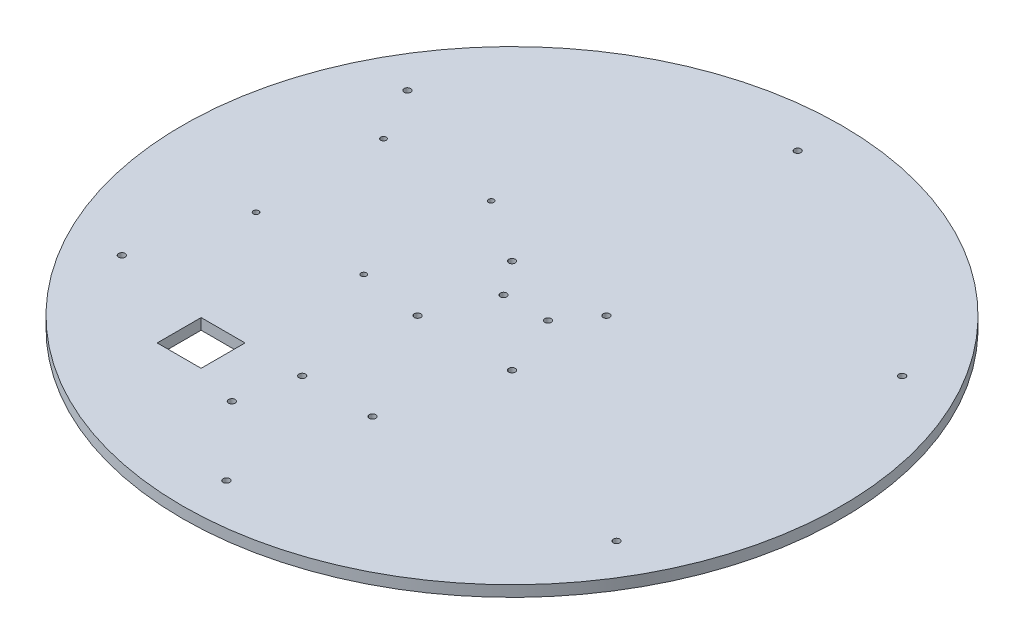
ISO-10303-21;
HEADER;
FILE_DESCRIPTION(('STEP AP214'),'2;1');
FILE_NAME('part.step','',(''),(''),'','','');
FILE_SCHEMA(('AUTOMOTIVE_DESIGN { 1 0 10303 214 1 1 1 1 }'));
ENDSEC;
DATA;
#1=APPLICATION_CONTEXT('core data for automotive mechanical design processes');
#2=APPLICATION_PROTOCOL_DEFINITION('international standard','automotive_design',2000,#1);
#3=PRODUCT_CONTEXT('',#1,'mechanical');
#4=PRODUCT('Part','Part','',(#3));
#5=PRODUCT_RELATED_PRODUCT_CATEGORY('part','',(#4));
#6=PRODUCT_DEFINITION_FORMATION('','',#4);
#7=PRODUCT_DEFINITION_CONTEXT('part definition',#1,'design');
#8=PRODUCT_DEFINITION('design','',#6,#7);
#9=PRODUCT_DEFINITION_SHAPE('','',#8);
#10=(LENGTH_UNIT() NAMED_UNIT(*) SI_UNIT(.MILLI.,.METRE.));
#11=(NAMED_UNIT(*) PLANE_ANGLE_UNIT() SI_UNIT($,.RADIAN.));
#12=(NAMED_UNIT(*) SI_UNIT($,.STERADIAN.) SOLID_ANGLE_UNIT());
#13=UNCERTAINTY_MEASURE_WITH_UNIT(LENGTH_MEASURE(1.E-05),#10,'distance_accuracy_value','');
#14=(GEOMETRIC_REPRESENTATION_CONTEXT(3) GLOBAL_UNCERTAINTY_ASSIGNED_CONTEXT((#13)) GLOBAL_UNIT_ASSIGNED_CONTEXT((#10,
#11,#12)) REPRESENTATION_CONTEXT('',''));
#15=CARTESIAN_POINT('',(0.,0.,0.));
#16=DIRECTION('',(0.,0.,1.));
#17=DIRECTION('',(1.,0.,0.));
#18=AXIS2_PLACEMENT_3D('',#15,#16,#17);
#19=CARTESIAN_POINT('',(0.,5.,0.));
#20=DIRECTION('',(0.,-1.,0.));
#21=DIRECTION('',(0.,0.,-1.));
#22=AXIS2_PLACEMENT_3D('',#19,#20,#21);
#23=CYLINDRICAL_SURFACE('',#22,150.);
#24=CARTESIAN_POINT('',(0.,5.,0.));
#25=DIRECTION('',(0.,1.,0.));
#26=DIRECTION('',(0.,0.,1.));
#27=AXIS2_PLACEMENT_3D('',#24,#25,#26);
#28=CIRCLE('',#27,150.);
#29=CARTESIAN_POINT('',(0.,5.,150.));
#30=VERTEX_POINT('',#29);
#31=EDGE_CURVE('E11',#30,#30,#28,.T.);
#32=ORIENTED_EDGE('',*,*,#31,.F.);
#33=EDGE_LOOP('',(#32));
#34=FACE_BOUND('',#33,.T.);
#35=CARTESIAN_POINT('',(0.,0.,0.));
#36=DIRECTION('',(0.,1.,0.));
#37=DIRECTION('',(0.,0.,1.));
#38=AXIS2_PLACEMENT_3D('',#35,#36,#37);
#39=CIRCLE('',#38,150.);
#40=CARTESIAN_POINT('',(0.,0.,150.));
#41=VERTEX_POINT('',#40);
#42=EDGE_CURVE('E42',#41,#41,#39,.T.);
#43=ORIENTED_EDGE('',*,*,#42,.T.);
#44=EDGE_LOOP('',(#43));
#45=FACE_BOUND('',#44,.T.);
#46=ADVANCED_FACE('F39',(#34,#45),#23,.T.);
#47=CARTESIAN_POINT('',(0.,5.,0.));
#48=DIRECTION('',(0.,1.,0.));
#49=DIRECTION('',(0.,0.,1.));
#50=AXIS2_PLACEMENT_3D('',#47,#48,#49);
#51=PLANE('',#50);
#52=CARTESIAN_POINT('',(-50.,5.,17.5));
#53=DIRECTION('',(0.,1.,0.));
#54=DIRECTION('',(0.,0.,1.));
#55=AXIS2_PLACEMENT_3D('',#52,#53,#54);
#56=CIRCLE('',#55,1.25);
#57=CARTESIAN_POINT('',(-50.,5.,18.75));
#58=VERTEX_POINT('',#57);
#59=EDGE_CURVE('E334',#58,#58,#56,.T.);
#60=ORIENTED_EDGE('',*,*,#59,.F.);
#61=EDGE_LOOP('',(#60));
#62=FACE_BOUND('',#61,.T.);
#63=CARTESIAN_POINT('',(-99.,5.,17.5));
#64=DIRECTION('',(0.,1.,0.));
#65=DIRECTION('',(0.,0.,1.));
#66=AXIS2_PLACEMENT_3D('',#63,#64,#65);
#67=CIRCLE('',#66,1.25);
#68=CARTESIAN_POINT('',(-99.,5.,18.75));
#69=VERTEX_POINT('',#68);
#70=EDGE_CURVE('E326',#69,#69,#67,.T.);
#71=ORIENTED_EDGE('',*,*,#70,.F.);
#72=EDGE_LOOP('',(#71));
#73=FACE_BOUND('',#72,.T.);
#74=CARTESIAN_POINT('',(-99.,5.,-40.5));
#75=DIRECTION('',(0.,1.,0.));
#76=DIRECTION('',(0.,0.,1.));
#77=AXIS2_PLACEMENT_3D('',#74,#75,#76);
#78=CIRCLE('',#77,1.25);
#79=CARTESIAN_POINT('',(-99.,5.,-39.25));
#80=VERTEX_POINT('',#79);
#81=EDGE_CURVE('E320',#80,#80,#78,.T.);
#82=ORIENTED_EDGE('',*,*,#81,.F.);
#83=EDGE_LOOP('',(#82));
#84=FACE_BOUND('',#83,.T.);
#85=CARTESIAN_POINT('',(-50.,5.,-40.5));
#86=DIRECTION('',(0.,1.,0.));
#87=DIRECTION('',(0.,0.,1.));
#88=AXIS2_PLACEMENT_3D('',#85,#86,#87);
#89=CIRCLE('',#88,1.25);
#90=CARTESIAN_POINT('',(-50.,5.,-39.25));
#91=VERTEX_POINT('',#90);
#92=EDGE_CURVE('E322',#91,#91,#89,.T.);
#93=ORIENTED_EDGE('',*,*,#92,.F.);
#94=EDGE_LOOP('',(#93));
#95=FACE_BOUND('',#94,.T.);
#96=DIRECTION('',(0.,0.,-1.));
#97=VECTOR('',#96,1.);
#98=CARTESIAN_POINT('',(-50.,5.,71.5));
#99=LINE('',#98,#97);
#100=CARTESIAN_POINT('',(-50.,5.,91.5));
#101=VERTEX_POINT('',#100);
#102=CARTESIAN_POINT('',(-50.,5.,71.5));
#103=VERTEX_POINT('',#102);
#104=EDGE_CURVE('E53',#101,#103,#99,.T.);
#105=ORIENTED_EDGE('',*,*,#104,.F.);
#106=DIRECTION('',(1.,0.,0.));
#107=VECTOR('',#106,1.);
#108=CARTESIAN_POINT('',(-70.,5.,91.5));
#109=LINE('',#108,#107);
#110=CARTESIAN_POINT('',(-70.,5.,91.5));
#111=VERTEX_POINT('',#110);
#112=EDGE_CURVE('E89',#111,#101,#109,.T.);
#113=ORIENTED_EDGE('',*,*,#112,.F.);
#114=DIRECTION('',(0.,0.,1.));
#115=VECTOR('',#114,1.);
#116=CARTESIAN_POINT('',(-70.,5.,71.5));
#117=LINE('',#116,#115);
#118=CARTESIAN_POINT('',(-70.,5.,71.5));
#119=VERTEX_POINT('',#118);
#120=EDGE_CURVE('E94',#119,#111,#117,.T.);
#121=ORIENTED_EDGE('',*,*,#120,.F.);
#122=DIRECTION('',(-1.,0.,0.));
#123=VECTOR('',#122,1.);
#124=CARTESIAN_POINT('',(-70.,5.,71.5));
#125=LINE('',#124,#123);
#126=EDGE_CURVE('E100',#103,#119,#125,.T.);
#127=ORIENTED_EDGE('',*,*,#126,.F.);
#128=EDGE_LOOP('',(#105,#113,#121,#127));
#129=FACE_BOUND('',#128,.T.);
#130=CARTESIAN_POINT('',(7.99999999999999,5.,71.5));
#131=DIRECTION('',(0.,1.,0.));
#132=DIRECTION('',(0.,0.,1.));
#133=AXIS2_PLACEMENT_3D('',#130,#131,#132);
#134=CIRCLE('',#133,1.5);
#135=CARTESIAN_POINT('',(7.99999999999999,5.,73.));
#136=VERTEX_POINT('',#135);
#137=EDGE_CURVE('E104',#136,#136,#134,.T.);
#138=ORIENTED_EDGE('',*,*,#137,.F.);
#139=EDGE_LOOP('',(#138));
#140=FACE_BOUND('',#139,.T.);
#141=CARTESIAN_POINT('',(-30.,5.,97.5));
#142=DIRECTION('',(0.,1.,0.));
#143=DIRECTION('',(0.,0.,1.));
#144=AXIS2_PLACEMENT_3D('',#141,#142,#143);
#145=CIRCLE('',#144,1.5);
#146=CARTESIAN_POINT('',(-30.,5.,99.));
#147=VERTEX_POINT('',#146);
#148=EDGE_CURVE('E124',#147,#147,#145,.T.);
#149=ORIENTED_EDGE('',*,*,#148,.F.);
#150=EDGE_LOOP('',(#149));
#151=FACE_BOUND('',#150,.T.);
#152=CARTESIAN_POINT('',(-24.,5.,71.5));
#153=DIRECTION('',(0.,1.,0.));
#154=DIRECTION('',(0.,0.,1.));
#155=AXIS2_PLACEMENT_3D('',#152,#153,#154);
#156=CIRCLE('',#155,1.5);
#157=CARTESIAN_POINT('',(-24.,5.,73.));
#158=VERTEX_POINT('',#157);
#159=EDGE_CURVE('E121',#158,#158,#156,.T.);
#160=ORIENTED_EDGE('',*,*,#159,.F.);
#161=EDGE_LOOP('',(#160));
#162=FACE_BOUND('',#161,.T.);
#163=CARTESIAN_POINT('',(21.5,5.,-21.5));
#164=DIRECTION('',(0.,1.,0.));
#165=DIRECTION('',(0.,0.,1.));
#166=AXIS2_PLACEMENT_3D('',#163,#164,#165);
#167=CIRCLE('',#166,1.5);
#168=CARTESIAN_POINT('',(21.5,5.,-20.));
#169=VERTEX_POINT('',#168);
#170=EDGE_CURVE('E131',#169,#169,#167,.T.);
#171=ORIENTED_EDGE('',*,*,#170,.F.);
#172=EDGE_LOOP('',(#171));
#173=FACE_BOUND('',#172,.T.);
#174=CARTESIAN_POINT('',(-21.5,5.,21.5));
#175=DIRECTION('',(0.,1.,0.));
#176=DIRECTION('',(0.,0.,1.));
#177=AXIS2_PLACEMENT_3D('',#174,#175,#176);
#178=CIRCLE('',#177,1.5);
#179=CARTESIAN_POINT('',(-21.5,5.,23.));
#180=VERTEX_POINT('',#179);
#181=EDGE_CURVE('E138',#180,#180,#178,.T.);
#182=ORIENTED_EDGE('',*,*,#181,.F.);
#183=EDGE_LOOP('',(#182));
#184=FACE_BOUND('',#183,.T.);
#185=CARTESIAN_POINT('',(21.5,5.,21.5));
#186=DIRECTION('',(0.,1.,0.));
#187=DIRECTION('',(0.,0.,1.));
#188=AXIS2_PLACEMENT_3D('',#185,#186,#187);
#189=CIRCLE('',#188,1.5);
#190=CARTESIAN_POINT('',(21.5,5.,23.));
#191=VERTEX_POINT('',#190);
#192=EDGE_CURVE('E125',#191,#191,#189,.T.);
#193=ORIENTED_EDGE('',*,*,#192,.F.);
#194=EDGE_LOOP('',(#193));
#195=FACE_BOUND('',#194,.T.);
#196=CARTESIAN_POINT('',(-21.5,5.,-21.5));
#197=DIRECTION('',(0.,1.,0.));
#198=DIRECTION('',(0.,0.,1.));
#199=AXIS2_PLACEMENT_3D('',#196,#197,#198);
#200=CIRCLE('',#199,1.5);
#201=CARTESIAN_POINT('',(-21.5,5.,-20.));
#202=VERTEX_POINT('',#201);
#203=EDGE_CURVE('E134',#202,#202,#200,.T.);
#204=ORIENTED_EDGE('',*,*,#203,.F.);
#205=EDGE_LOOP('',(#204));
#206=FACE_BOUND('',#205,.T.);
#207=CARTESIAN_POINT('',(-10.1,5.,-6.25));
#208=DIRECTION('',(0.,1.,0.));
#209=DIRECTION('',(0.,0.,1.));
#210=AXIS2_PLACEMENT_3D('',#207,#208,#209);
#211=CIRCLE('',#210,1.5);
#212=CARTESIAN_POINT('',(-10.1,5.,-4.75));
#213=VERTEX_POINT('',#212);
#214=EDGE_CURVE('E153',#213,#213,#211,.T.);
#215=ORIENTED_EDGE('',*,*,#214,.F.);
#216=EDGE_LOOP('',(#215));
#217=FACE_BOUND('',#216,.T.);
#218=CARTESIAN_POINT('',(10.1,5.,-6.25));
#219=DIRECTION('',(0.,1.,0.));
#220=DIRECTION('',(0.,0.,1.));
#221=AXIS2_PLACEMENT_3D('',#218,#219,#220);
#222=CIRCLE('',#221,1.5);
#223=CARTESIAN_POINT('',(10.1,5.,-4.75));
#224=VERTEX_POINT('',#223);
#225=EDGE_CURVE('E156',#224,#224,#222,.T.);
#226=ORIENTED_EDGE('',*,*,#225,.F.);
#227=EDGE_LOOP('',(#226));
#228=FACE_BOUND('',#227,.T.);
#229=CARTESIAN_POINT('',(0.,5.,-130.));
#230=DIRECTION('',(0.,1.,0.));
#231=DIRECTION('',(0.,0.,1.));
#232=AXIS2_PLACEMENT_3D('',#229,#230,#231);
#233=CIRCLE('',#232,1.5);
#234=CARTESIAN_POINT('',(0.,5.,-128.5));
#235=VERTEX_POINT('',#234);
#236=EDGE_CURVE('E164',#235,#235,#233,.T.);
#237=ORIENTED_EDGE('',*,*,#236,.F.);
#238=EDGE_LOOP('',(#237));
#239=FACE_BOUND('',#238,.T.);
#240=CARTESIAN_POINT('',(-112.583302491976,5.,-65.0000000000013));
#241=DIRECTION('',(0.,1.,0.));
#242=DIRECTION('',(0.,0.,1.));
#243=AXIS2_PLACEMENT_3D('',#240,#241,#242);
#244=CIRCLE('',#243,1.5);
#245=CARTESIAN_POINT('',(-112.583302491976,5.,-63.5000000000013));
#246=VERTEX_POINT('',#245);
#247=EDGE_CURVE('E168',#246,#246,#244,.T.);
#248=ORIENTED_EDGE('',*,*,#247,.F.);
#249=EDGE_LOOP('',(#248));
#250=FACE_BOUND('',#249,.T.);
#251=CARTESIAN_POINT('',(-112.583302491978,5.,64.999999999999));
#252=DIRECTION('',(0.,1.,0.));
#253=DIRECTION('',(0.,0.,1.));
#254=AXIS2_PLACEMENT_3D('',#251,#252,#253);
#255=CIRCLE('',#254,1.50000000000002);
#256=CARTESIAN_POINT('',(-112.583302491978,5.,66.499999999999));
#257=VERTEX_POINT('',#256);
#258=EDGE_CURVE('E191',#257,#257,#255,.T.);
#259=ORIENTED_EDGE('',*,*,#258,.F.);
#260=EDGE_LOOP('',(#259));
#261=FACE_BOUND('',#260,.T.);
#262=CARTESIAN_POINT('',(-8.94839757847876E-13,5.,130.));
#263=DIRECTION('',(0.,1.,0.));
#264=DIRECTION('',(0.,0.,1.));
#265=AXIS2_PLACEMENT_3D('',#262,#263,#264);
#266=CIRCLE('',#265,1.5);
#267=CARTESIAN_POINT('',(-8.94839757847876E-13,5.,131.5));
#268=VERTEX_POINT('',#267);
#269=EDGE_CURVE('E185',#268,#268,#266,.T.);
#270=ORIENTED_EDGE('',*,*,#269,.F.);
#271=EDGE_LOOP('',(#270));
#272=FACE_BOUND('',#271,.T.);
#273=CARTESIAN_POINT('',(112.583302491977,5.,65.0000000000005));
#274=DIRECTION('',(0.,1.,0.));
#275=DIRECTION('',(0.,0.,1.));
#276=AXIS2_PLACEMENT_3D('',#273,#274,#275);
#277=CIRCLE('',#276,1.50000000000651);
#278=CARTESIAN_POINT('',(112.583302491977,5.,66.500000000007));
#279=VERTEX_POINT('',#278);
#280=EDGE_CURVE('E179',#279,#279,#277,.T.);
#281=ORIENTED_EDGE('',*,*,#280,.F.);
#282=EDGE_LOOP('',(#281));
#283=FACE_BOUND('',#282,.T.);
#284=CARTESIAN_POINT('',(112.583302491978,5.,-64.9999999999981));
#285=DIRECTION('',(0.,1.,0.));
#286=DIRECTION('',(0.,0.,1.));
#287=AXIS2_PLACEMENT_3D('',#284,#285,#286);
#288=CIRCLE('',#287,1.50000000000931);
#289=CARTESIAN_POINT('',(112.583302491978,5.,-63.4999999999888));
#290=VERTEX_POINT('',#289);
#291=EDGE_CURVE('E167',#290,#290,#288,.T.);
#292=ORIENTED_EDGE('',*,*,#291,.F.);
#293=EDGE_LOOP('',(#292));
#294=FACE_BOUND('',#293,.T.);
#295=ORIENTED_EDGE('',*,*,#31,.T.);
#296=EDGE_LOOP('',(#295));
#297=FACE_BOUND('',#296,.T.);
#298=ADVANCED_FACE('F97',(#62,#73,#84,#95,#129,#140,#151,#162,#173,#184,#195,#206,#217,#228,
#239,#250,#261,#272,#283,#294,#297),#51,.T.);
#299=CARTESIAN_POINT('',(0.,0.,0.));
#300=DIRECTION('',(0.,1.,0.));
#301=DIRECTION('',(0.,0.,1.));
#302=AXIS2_PLACEMENT_3D('',#299,#300,#301);
#303=PLANE('',#302);
#304=CARTESIAN_POINT('',(-50.,0.,17.5));
#305=DIRECTION('',(0.,1.,0.));
#306=DIRECTION('',(0.,0.,1.));
#307=AXIS2_PLACEMENT_3D('',#304,#305,#306);
#308=CIRCLE('',#307,1.25);
#309=CARTESIAN_POINT('',(-50.,0.,18.75));
#310=VERTEX_POINT('',#309);
#311=EDGE_CURVE('E337',#310,#310,#308,.T.);
#312=ORIENTED_EDGE('',*,*,#311,.T.);
#313=EDGE_LOOP('',(#312));
#314=FACE_BOUND('',#313,.T.);
#315=CARTESIAN_POINT('',(-99.,0.,17.5));
#316=DIRECTION('',(0.,1.,0.));
#317=DIRECTION('',(0.,0.,1.));
#318=AXIS2_PLACEMENT_3D('',#315,#316,#317);
#319=CIRCLE('',#318,1.25);
#320=CARTESIAN_POINT('',(-99.,0.,18.75));
#321=VERTEX_POINT('',#320);
#322=EDGE_CURVE('E331',#321,#321,#319,.T.);
#323=ORIENTED_EDGE('',*,*,#322,.T.);
#324=EDGE_LOOP('',(#323));
#325=FACE_BOUND('',#324,.T.);
#326=CARTESIAN_POINT('',(-99.,0.,-40.5));
#327=DIRECTION('',(0.,1.,0.));
#328=DIRECTION('',(0.,0.,1.));
#329=AXIS2_PLACEMENT_3D('',#326,#327,#328);
#330=CIRCLE('',#329,1.25);
#331=CARTESIAN_POINT('',(-99.,0.,-39.25));
#332=VERTEX_POINT('',#331);
#333=EDGE_CURVE('E317',#332,#332,#330,.T.);
#334=ORIENTED_EDGE('',*,*,#333,.T.);
#335=EDGE_LOOP('',(#334));
#336=FACE_BOUND('',#335,.T.);
#337=CARTESIAN_POINT('',(-50.,0.,-40.5));
#338=DIRECTION('',(0.,1.,0.));
#339=DIRECTION('',(0.,0.,1.));
#340=AXIS2_PLACEMENT_3D('',#337,#338,#339);
#341=CIRCLE('',#340,1.25);
#342=CARTESIAN_POINT('',(-50.,0.,-39.25));
#343=VERTEX_POINT('',#342);
#344=EDGE_CURVE('E86',#343,#343,#341,.T.);
#345=ORIENTED_EDGE('',*,*,#344,.T.);
#346=EDGE_LOOP('',(#345));
#347=FACE_BOUND('',#346,.T.);
#348=DIRECTION('',(1.,0.,0.));
#349=VECTOR('',#348,1.);
#350=CARTESIAN_POINT('',(-70.,0.,91.5));
#351=LINE('',#350,#349);
#352=CARTESIAN_POINT('',(-70.,0.,91.5));
#353=VERTEX_POINT('',#352);
#354=CARTESIAN_POINT('',(-50.,0.,91.5));
#355=VERTEX_POINT('',#354);
#356=EDGE_CURVE('E109',#353,#355,#351,.T.);
#357=ORIENTED_EDGE('',*,*,#356,.T.);
#358=DIRECTION('',(0.,0.,-1.));
#359=VECTOR('',#358,1.);
#360=CARTESIAN_POINT('',(-50.,0.,71.5));
#361=LINE('',#360,#359);
#362=CARTESIAN_POINT('',(-50.,0.,71.5));
#363=VERTEX_POINT('',#362);
#364=EDGE_CURVE('E81',#355,#363,#361,.T.);
#365=ORIENTED_EDGE('',*,*,#364,.T.);
#366=DIRECTION('',(-1.,0.,0.));
#367=VECTOR('',#366,1.);
#368=CARTESIAN_POINT('',(-70.,0.,71.5));
#369=LINE('',#368,#367);
#370=CARTESIAN_POINT('',(-70.,0.,71.5));
#371=VERTEX_POINT('',#370);
#372=EDGE_CURVE('E113',#363,#371,#369,.T.);
#373=ORIENTED_EDGE('',*,*,#372,.T.);
#374=DIRECTION('',(0.,0.,1.));
#375=VECTOR('',#374,1.);
#376=CARTESIAN_POINT('',(-70.,0.,71.5));
#377=LINE('',#376,#375);
#378=EDGE_CURVE('E61',#371,#353,#377,.T.);
#379=ORIENTED_EDGE('',*,*,#378,.T.);
#380=EDGE_LOOP('',(#357,#365,#373,#379));
#381=FACE_BOUND('',#380,.T.);
#382=CARTESIAN_POINT('',(7.99999999999999,0.,71.5));
#383=DIRECTION('',(0.,1.,0.));
#384=DIRECTION('',(0.,0.,1.));
#385=AXIS2_PLACEMENT_3D('',#382,#383,#384);
#386=CIRCLE('',#385,1.5);
#387=CARTESIAN_POINT('',(7.99999999999999,0.,73.));
#388=VERTEX_POINT('',#387);
#389=EDGE_CURVE('E101',#388,#388,#386,.T.);
#390=ORIENTED_EDGE('',*,*,#389,.T.);
#391=EDGE_LOOP('',(#390));
#392=FACE_BOUND('',#391,.T.);
#393=CARTESIAN_POINT('',(-30.,0.,97.5));
#394=DIRECTION('',(0.,1.,0.));
#395=DIRECTION('',(0.,0.,1.));
#396=AXIS2_PLACEMENT_3D('',#393,#394,#395);
#397=CIRCLE('',#396,1.5);
#398=CARTESIAN_POINT('',(-30.,0.,99.));
#399=VERTEX_POINT('',#398);
#400=EDGE_CURVE('E343',#399,#399,#397,.T.);
#401=ORIENTED_EDGE('',*,*,#400,.T.);
#402=EDGE_LOOP('',(#401));
#403=FACE_BOUND('',#402,.T.);
#404=CARTESIAN_POINT('',(-24.,0.,71.5));
#405=DIRECTION('',(0.,1.,0.));
#406=DIRECTION('',(0.,0.,1.));
#407=AXIS2_PLACEMENT_3D('',#404,#405,#406);
#408=CIRCLE('',#407,1.5);
#409=CARTESIAN_POINT('',(-24.,0.,73.));
#410=VERTEX_POINT('',#409);
#411=EDGE_CURVE('E117',#410,#410,#408,.T.);
#412=ORIENTED_EDGE('',*,*,#411,.T.);
#413=EDGE_LOOP('',(#412));
#414=FACE_BOUND('',#413,.T.);
#415=CARTESIAN_POINT('',(21.5,0.,-21.5));
#416=DIRECTION('',(0.,1.,0.));
#417=DIRECTION('',(0.,0.,1.));
#418=AXIS2_PLACEMENT_3D('',#415,#416,#417);
#419=CIRCLE('',#418,1.5);
#420=CARTESIAN_POINT('',(21.5,0.,-20.));
#421=VERTEX_POINT('',#420);
#422=EDGE_CURVE('E135',#421,#421,#419,.T.);
#423=ORIENTED_EDGE('',*,*,#422,.T.);
#424=EDGE_LOOP('',(#423));
#425=FACE_BOUND('',#424,.T.);
#426=CARTESIAN_POINT('',(-21.5,0.,21.5));
#427=DIRECTION('',(0.,1.,0.));
#428=DIRECTION('',(0.,0.,1.));
#429=AXIS2_PLACEMENT_3D('',#426,#427,#428);
#430=CIRCLE('',#429,1.5);
#431=CARTESIAN_POINT('',(-21.5,0.,23.));
#432=VERTEX_POINT('',#431);
#433=EDGE_CURVE('E128',#432,#432,#430,.T.);
#434=ORIENTED_EDGE('',*,*,#433,.T.);
#435=EDGE_LOOP('',(#434));
#436=FACE_BOUND('',#435,.T.);
#437=CARTESIAN_POINT('',(21.5,0.,21.5));
#438=DIRECTION('',(0.,1.,0.));
#439=DIRECTION('',(0.,0.,1.));
#440=AXIS2_PLACEMENT_3D('',#437,#438,#439);
#441=CIRCLE('',#440,1.5);
#442=CARTESIAN_POINT('',(21.5,0.,23.));
#443=VERTEX_POINT('',#442);
#444=EDGE_CURVE('E120',#443,#443,#441,.T.);
#445=ORIENTED_EDGE('',*,*,#444,.T.);
#446=EDGE_LOOP('',(#445));
#447=FACE_BOUND('',#446,.T.);
#448=CARTESIAN_POINT('',(-21.5,0.,-21.5));
#449=DIRECTION('',(0.,1.,0.));
#450=DIRECTION('',(0.,0.,1.));
#451=AXIS2_PLACEMENT_3D('',#448,#449,#450);
#452=CIRCLE('',#451,1.5);
#453=CARTESIAN_POINT('',(-21.5,0.,-20.));
#454=VERTEX_POINT('',#453);
#455=EDGE_CURVE('E143',#454,#454,#452,.T.);
#456=ORIENTED_EDGE('',*,*,#455,.T.);
#457=EDGE_LOOP('',(#456));
#458=FACE_BOUND('',#457,.T.);
#459=CARTESIAN_POINT('',(-10.1,0.,-6.25));
#460=DIRECTION('',(0.,1.,0.));
#461=DIRECTION('',(0.,0.,1.));
#462=AXIS2_PLACEMENT_3D('',#459,#460,#461);
#463=CIRCLE('',#462,1.5);
#464=CARTESIAN_POINT('',(-10.1,0.,-4.75));
#465=VERTEX_POINT('',#464);
#466=EDGE_CURVE('E149',#465,#465,#463,.T.);
#467=ORIENTED_EDGE('',*,*,#466,.T.);
#468=EDGE_LOOP('',(#467));
#469=FACE_BOUND('',#468,.T.);
#470=CARTESIAN_POINT('',(10.1,0.,-6.25));
#471=DIRECTION('',(0.,1.,0.));
#472=DIRECTION('',(0.,0.,1.));
#473=AXIS2_PLACEMENT_3D('',#470,#471,#472);
#474=CIRCLE('',#473,1.5);
#475=CARTESIAN_POINT('',(10.1,0.,-4.75));
#476=VERTEX_POINT('',#475);
#477=EDGE_CURVE('E146',#476,#476,#474,.T.);
#478=ORIENTED_EDGE('',*,*,#477,.T.);
#479=EDGE_LOOP('',(#478));
#480=FACE_BOUND('',#479,.T.);
#481=CARTESIAN_POINT('',(0.,0.,-130.));
#482=DIRECTION('',(0.,1.,0.));
#483=DIRECTION('',(0.,0.,1.));
#484=AXIS2_PLACEMENT_3D('',#481,#482,#483);
#485=CIRCLE('',#484,1.5);
#486=CARTESIAN_POINT('',(0.,0.,-128.5));
#487=VERTEX_POINT('',#486);
#488=EDGE_CURVE('E161',#487,#487,#485,.T.);
#489=ORIENTED_EDGE('',*,*,#488,.T.);
#490=EDGE_LOOP('',(#489));
#491=FACE_BOUND('',#490,.T.);
#492=CARTESIAN_POINT('',(-112.583302491976,0.,-65.0000000000013));
#493=DIRECTION('',(0.,1.,0.));
#494=DIRECTION('',(0.,0.,1.));
#495=AXIS2_PLACEMENT_3D('',#492,#493,#494);
#496=CIRCLE('',#495,1.5);
#497=CARTESIAN_POINT('',(-112.583302491976,0.,-63.5000000000013));
#498=VERTEX_POINT('',#497);
#499=EDGE_CURVE('E152',#498,#498,#496,.T.);
#500=ORIENTED_EDGE('',*,*,#499,.T.);
#501=EDGE_LOOP('',(#500));
#502=FACE_BOUND('',#501,.T.);
#503=CARTESIAN_POINT('',(-112.583302491978,0.,64.999999999999));
#504=DIRECTION('',(0.,1.,0.));
#505=DIRECTION('',(0.,0.,1.));
#506=AXIS2_PLACEMENT_3D('',#503,#504,#505);
#507=CIRCLE('',#506,1.50000000000002);
#508=CARTESIAN_POINT('',(-112.583302491978,0.,66.499999999999));
#509=VERTEX_POINT('',#508);
#510=EDGE_CURVE('E171',#509,#509,#507,.T.);
#511=ORIENTED_EDGE('',*,*,#510,.T.);
#512=EDGE_LOOP('',(#511));
#513=FACE_BOUND('',#512,.T.);
#514=CARTESIAN_POINT('',(-8.94839757847876E-13,0.,130.));
#515=DIRECTION('',(0.,1.,0.));
#516=DIRECTION('',(0.,0.,1.));
#517=AXIS2_PLACEMENT_3D('',#514,#515,#516);
#518=CIRCLE('',#517,1.5);
#519=CARTESIAN_POINT('',(-8.94839757847876E-13,0.,131.5));
#520=VERTEX_POINT('',#519);
#521=EDGE_CURVE('E188',#520,#520,#518,.T.);
#522=ORIENTED_EDGE('',*,*,#521,.T.);
#523=EDGE_LOOP('',(#522));
#524=FACE_BOUND('',#523,.T.);
#525=CARTESIAN_POINT('',(112.583302491977,0.,65.0000000000005));
#526=DIRECTION('',(0.,1.,0.));
#527=DIRECTION('',(0.,0.,1.));
#528=AXIS2_PLACEMENT_3D('',#525,#526,#527);
#529=CIRCLE('',#528,1.50000000000651);
#530=CARTESIAN_POINT('',(112.583302491977,0.,66.500000000007));
#531=VERTEX_POINT('',#530);
#532=EDGE_CURVE('E182',#531,#531,#529,.T.);
#533=ORIENTED_EDGE('',*,*,#532,.T.);
#534=EDGE_LOOP('',(#533));
#535=FACE_BOUND('',#534,.T.);
#536=CARTESIAN_POINT('',(112.583302491978,0.,-64.9999999999981));
#537=DIRECTION('',(0.,1.,0.));
#538=DIRECTION('',(0.,0.,1.));
#539=AXIS2_PLACEMENT_3D('',#536,#537,#538);
#540=CIRCLE('',#539,1.50000000000931);
#541=CARTESIAN_POINT('',(112.583302491978,0.,-63.4999999999888));
#542=VERTEX_POINT('',#541);
#543=EDGE_CURVE('E176',#542,#542,#540,.T.);
#544=ORIENTED_EDGE('',*,*,#543,.T.);
#545=EDGE_LOOP('',(#544));
#546=FACE_BOUND('',#545,.T.);
#547=ORIENTED_EDGE('',*,*,#42,.F.);
#548=EDGE_LOOP('',(#547));
#549=FACE_BOUND('',#548,.T.);
#550=ADVANCED_FACE('F197',(#314,#325,#336,#347,#381,#392,#403,#414,#425,#436,#447,#458,#469,
#480,#491,#502,#513,#524,#535,#546,#549),#303,.F.);
#551=CARTESIAN_POINT('',(112.583302491978,0.,-64.9999999999981));
#552=DIRECTION('',(0.,1.,0.));
#553=DIRECTION('',(0.,0.,1.));
#554=AXIS2_PLACEMENT_3D('',#551,#552,#553);
#555=CYLINDRICAL_SURFACE('',#554,1.50000000000931);
#556=ORIENTED_EDGE('',*,*,#543,.F.);
#557=EDGE_LOOP('',(#556));
#558=FACE_BOUND('',#557,.T.);
#559=ORIENTED_EDGE('',*,*,#291,.T.);
#560=EDGE_LOOP('',(#559));
#561=FACE_BOUND('',#560,.T.);
#562=ADVANCED_FACE('F226',(#558,#561),#555,.F.);
#563=CARTESIAN_POINT('',(112.583302491977,0.,65.0000000000005));
#564=DIRECTION('',(0.,1.,0.));
#565=DIRECTION('',(0.,0.,1.));
#566=AXIS2_PLACEMENT_3D('',#563,#564,#565);
#567=CYLINDRICAL_SURFACE('',#566,1.50000000000651);
#568=ORIENTED_EDGE('',*,*,#532,.F.);
#569=EDGE_LOOP('',(#568));
#570=FACE_BOUND('',#569,.T.);
#571=ORIENTED_EDGE('',*,*,#280,.T.);
#572=EDGE_LOOP('',(#571));
#573=FACE_BOUND('',#572,.T.);
#574=ADVANCED_FACE('F232',(#570,#573),#567,.F.);
#575=CARTESIAN_POINT('',(-8.94839757847876E-13,0.,130.));
#576=DIRECTION('',(0.,1.,0.));
#577=DIRECTION('',(0.,0.,1.));
#578=AXIS2_PLACEMENT_3D('',#575,#576,#577);
#579=CYLINDRICAL_SURFACE('',#578,1.5);
#580=ORIENTED_EDGE('',*,*,#521,.F.);
#581=EDGE_LOOP('',(#580));
#582=FACE_BOUND('',#581,.T.);
#583=ORIENTED_EDGE('',*,*,#269,.T.);
#584=EDGE_LOOP('',(#583));
#585=FACE_BOUND('',#584,.T.);
#586=ADVANCED_FACE('F204',(#582,#585),#579,.F.);
#587=CARTESIAN_POINT('',(-112.583302491978,0.,64.999999999999));
#588=DIRECTION('',(0.,1.,0.));
#589=DIRECTION('',(0.,0.,1.));
#590=AXIS2_PLACEMENT_3D('',#587,#588,#589);
#591=CYLINDRICAL_SURFACE('',#590,1.50000000000002);
#592=ORIENTED_EDGE('',*,*,#510,.F.);
#593=EDGE_LOOP('',(#592));
#594=FACE_BOUND('',#593,.T.);
#595=ORIENTED_EDGE('',*,*,#258,.T.);
#596=EDGE_LOOP('',(#595));
#597=FACE_BOUND('',#596,.T.);
#598=ADVANCED_FACE('F200',(#594,#597),#591,.F.);
#599=CARTESIAN_POINT('',(-112.583302491976,0.,-65.0000000000013));
#600=DIRECTION('',(0.,1.,0.));
#601=DIRECTION('',(0.,0.,1.));
#602=AXIS2_PLACEMENT_3D('',#599,#600,#601);
#603=CYLINDRICAL_SURFACE('',#602,1.5);
#604=ORIENTED_EDGE('',*,*,#499,.F.);
#605=EDGE_LOOP('',(#604));
#606=FACE_BOUND('',#605,.T.);
#607=ORIENTED_EDGE('',*,*,#247,.T.);
#608=EDGE_LOOP('',(#607));
#609=FACE_BOUND('',#608,.T.);
#610=ADVANCED_FACE('F203',(#606,#609),#603,.F.);
#611=CARTESIAN_POINT('',(0.,0.,-130.));
#612=DIRECTION('',(0.,1.,0.));
#613=DIRECTION('',(0.,0.,1.));
#614=AXIS2_PLACEMENT_3D('',#611,#612,#613);
#615=CYLINDRICAL_SURFACE('',#614,1.5);
#616=ORIENTED_EDGE('',*,*,#488,.F.);
#617=EDGE_LOOP('',(#616));
#618=FACE_BOUND('',#617,.T.);
#619=ORIENTED_EDGE('',*,*,#236,.T.);
#620=EDGE_LOOP('',(#619));
#621=FACE_BOUND('',#620,.T.);
#622=ADVANCED_FACE('F246',(#618,#621),#615,.F.);
#623=CARTESIAN_POINT('',(10.1,0.,-6.25));
#624=DIRECTION('',(0.,1.,0.));
#625=DIRECTION('',(0.,0.,1.));
#626=AXIS2_PLACEMENT_3D('',#623,#624,#625);
#627=CYLINDRICAL_SURFACE('',#626,1.5);
#628=ORIENTED_EDGE('',*,*,#477,.F.);
#629=EDGE_LOOP('',(#628));
#630=FACE_BOUND('',#629,.T.);
#631=ORIENTED_EDGE('',*,*,#225,.T.);
#632=EDGE_LOOP('',(#631));
#633=FACE_BOUND('',#632,.T.);
#634=ADVANCED_FACE('F250',(#630,#633),#627,.F.);
#635=CARTESIAN_POINT('',(-10.1,0.,-6.25));
#636=DIRECTION('',(0.,1.,0.));
#637=DIRECTION('',(0.,0.,1.));
#638=AXIS2_PLACEMENT_3D('',#635,#636,#637);
#639=CYLINDRICAL_SURFACE('',#638,1.5);
#640=ORIENTED_EDGE('',*,*,#466,.F.);
#641=EDGE_LOOP('',(#640));
#642=FACE_BOUND('',#641,.T.);
#643=ORIENTED_EDGE('',*,*,#214,.T.);
#644=EDGE_LOOP('',(#643));
#645=FACE_BOUND('',#644,.T.);
#646=ADVANCED_FACE('F254',(#642,#645),#639,.F.);
#647=CARTESIAN_POINT('',(-21.5,0.,-21.5));
#648=DIRECTION('',(0.,1.,0.));
#649=DIRECTION('',(0.,0.,1.));
#650=AXIS2_PLACEMENT_3D('',#647,#648,#649);
#651=CYLINDRICAL_SURFACE('',#650,1.5);
#652=ORIENTED_EDGE('',*,*,#455,.F.);
#653=EDGE_LOOP('',(#652));
#654=FACE_BOUND('',#653,.T.);
#655=ORIENTED_EDGE('',*,*,#203,.T.);
#656=EDGE_LOOP('',(#655));
#657=FACE_BOUND('',#656,.T.);
#658=ADVANCED_FACE('F258',(#654,#657),#651,.F.);
#659=CARTESIAN_POINT('',(21.5,0.,21.5));
#660=DIRECTION('',(0.,1.,0.));
#661=DIRECTION('',(0.,0.,1.));
#662=AXIS2_PLACEMENT_3D('',#659,#660,#661);
#663=CYLINDRICAL_SURFACE('',#662,1.5);
#664=ORIENTED_EDGE('',*,*,#444,.F.);
#665=EDGE_LOOP('',(#664));
#666=FACE_BOUND('',#665,.T.);
#667=ORIENTED_EDGE('',*,*,#192,.T.);
#668=EDGE_LOOP('',(#667));
#669=FACE_BOUND('',#668,.T.);
#670=ADVANCED_FACE('F262',(#666,#669),#663,.F.);
#671=CARTESIAN_POINT('',(-21.5,0.,21.5));
#672=DIRECTION('',(0.,1.,0.));
#673=DIRECTION('',(0.,0.,1.));
#674=AXIS2_PLACEMENT_3D('',#671,#672,#673);
#675=CYLINDRICAL_SURFACE('',#674,1.5);
#676=ORIENTED_EDGE('',*,*,#433,.F.);
#677=EDGE_LOOP('',(#676));
#678=FACE_BOUND('',#677,.T.);
#679=ORIENTED_EDGE('',*,*,#181,.T.);
#680=EDGE_LOOP('',(#679));
#681=FACE_BOUND('',#680,.T.);
#682=ADVANCED_FACE('F264',(#678,#681),#675,.F.);
#683=CARTESIAN_POINT('',(21.5,0.,-21.5));
#684=DIRECTION('',(0.,1.,0.));
#685=DIRECTION('',(0.,0.,1.));
#686=AXIS2_PLACEMENT_3D('',#683,#684,#685);
#687=CYLINDRICAL_SURFACE('',#686,1.5);
#688=ORIENTED_EDGE('',*,*,#422,.F.);
#689=EDGE_LOOP('',(#688));
#690=FACE_BOUND('',#689,.T.);
#691=ORIENTED_EDGE('',*,*,#170,.T.);
#692=EDGE_LOOP('',(#691));
#693=FACE_BOUND('',#692,.T.);
#694=ADVANCED_FACE('F267',(#690,#693),#687,.F.);
#695=CARTESIAN_POINT('',(-24.,0.,71.5));
#696=DIRECTION('',(0.,1.,0.));
#697=DIRECTION('',(0.,0.,1.));
#698=AXIS2_PLACEMENT_3D('',#695,#696,#697);
#699=CYLINDRICAL_SURFACE('',#698,1.5);
#700=ORIENTED_EDGE('',*,*,#411,.F.);
#701=EDGE_LOOP('',(#700));
#702=FACE_BOUND('',#701,.T.);
#703=ORIENTED_EDGE('',*,*,#159,.T.);
#704=EDGE_LOOP('',(#703));
#705=FACE_BOUND('',#704,.T.);
#706=ADVANCED_FACE('F271',(#702,#705),#699,.F.);
#707=CARTESIAN_POINT('',(-30.,0.,97.5));
#708=DIRECTION('',(0.,1.,0.));
#709=DIRECTION('',(0.,0.,1.));
#710=AXIS2_PLACEMENT_3D('',#707,#708,#709);
#711=CYLINDRICAL_SURFACE('',#710,1.5);
#712=ORIENTED_EDGE('',*,*,#400,.F.);
#713=EDGE_LOOP('',(#712));
#714=FACE_BOUND('',#713,.T.);
#715=ORIENTED_EDGE('',*,*,#148,.T.);
#716=EDGE_LOOP('',(#715));
#717=FACE_BOUND('',#716,.T.);
#718=ADVANCED_FACE('F278',(#714,#717),#711,.F.);
#719=CARTESIAN_POINT('',(7.99999999999999,0.,71.5));
#720=DIRECTION('',(0.,1.,0.));
#721=DIRECTION('',(0.,0.,1.));
#722=AXIS2_PLACEMENT_3D('',#719,#720,#721);
#723=CYLINDRICAL_SURFACE('',#722,1.5);
#724=ORIENTED_EDGE('',*,*,#389,.F.);
#725=EDGE_LOOP('',(#724));
#726=FACE_BOUND('',#725,.T.);
#727=ORIENTED_EDGE('',*,*,#137,.T.);
#728=EDGE_LOOP('',(#727));
#729=FACE_BOUND('',#728,.T.);
#730=ADVANCED_FACE('F292',(#726,#729),#723,.F.);
#731=CARTESIAN_POINT('',(-50.,0.,71.5));
#732=DIRECTION('',(1.,0.,0.));
#733=DIRECTION('',(0.,0.,-1.));
#734=AXIS2_PLACEMENT_3D('',#731,#732,#733);
#735=PLANE('',#734);
#736=ORIENTED_EDGE('',*,*,#104,.T.);
#737=DIRECTION('',(0.,1.,0.));
#738=VECTOR('',#737,1.);
#739=CARTESIAN_POINT('',(-50.,0.,71.5));
#740=LINE('',#739,#738);
#741=EDGE_CURVE('E111',#363,#103,#740,.T.);
#742=ORIENTED_EDGE('',*,*,#741,.F.);
#743=ORIENTED_EDGE('',*,*,#364,.F.);
#744=DIRECTION('',(0.,1.,0.));
#745=VECTOR('',#744,1.);
#746=CARTESIAN_POINT('',(-50.,0.,91.5));
#747=LINE('',#746,#745);
#748=EDGE_CURVE('E77',#355,#101,#747,.T.);
#749=ORIENTED_EDGE('',*,*,#748,.T.);
#750=EDGE_LOOP('',(#736,#742,#743,#749));
#751=FACE_BOUND('',#750,.T.);
#752=ADVANCED_FACE('F79',(#751),#735,.F.);
#753=CARTESIAN_POINT('',(-70.,0.,91.5));
#754=DIRECTION('',(0.,0.,1.));
#755=DIRECTION('',(1.,0.,0.));
#756=AXIS2_PLACEMENT_3D('',#753,#754,#755);
#757=PLANE('',#756);
#758=ORIENTED_EDGE('',*,*,#112,.T.);
#759=ORIENTED_EDGE('',*,*,#748,.F.);
#760=ORIENTED_EDGE('',*,*,#356,.F.);
#761=DIRECTION('',(0.,1.,0.));
#762=VECTOR('',#761,1.);
#763=CARTESIAN_POINT('',(-70.,0.,91.5));
#764=LINE('',#763,#762);
#765=EDGE_CURVE('E85',#353,#111,#764,.T.);
#766=ORIENTED_EDGE('',*,*,#765,.T.);
#767=EDGE_LOOP('',(#758,#759,#760,#766));
#768=FACE_BOUND('',#767,.T.);
#769=ADVANCED_FACE('F90',(#768),#757,.F.);
#770=CARTESIAN_POINT('',(-70.,0.,71.5));
#771=DIRECTION('',(-1.,0.,0.));
#772=DIRECTION('',(0.,0.,1.));
#773=AXIS2_PLACEMENT_3D('',#770,#771,#772);
#774=PLANE('',#773);
#775=ORIENTED_EDGE('',*,*,#120,.T.);
#776=ORIENTED_EDGE('',*,*,#765,.F.);
#777=ORIENTED_EDGE('',*,*,#378,.F.);
#778=DIRECTION('',(0.,1.,0.));
#779=VECTOR('',#778,1.);
#780=CARTESIAN_POINT('',(-70.,0.,71.5));
#781=LINE('',#780,#779);
#782=EDGE_CURVE('E349',#371,#119,#781,.T.);
#783=ORIENTED_EDGE('',*,*,#782,.T.);
#784=EDGE_LOOP('',(#775,#776,#777,#783));
#785=FACE_BOUND('',#784,.T.);
#786=ADVANCED_FACE('F282',(#785),#774,.F.);
#787=CARTESIAN_POINT('',(-70.,0.,71.5));
#788=DIRECTION('',(0.,0.,-1.));
#789=DIRECTION('',(-1.,0.,0.));
#790=AXIS2_PLACEMENT_3D('',#787,#788,#789);
#791=PLANE('',#790);
#792=ORIENTED_EDGE('',*,*,#126,.T.);
#793=ORIENTED_EDGE('',*,*,#782,.F.);
#794=ORIENTED_EDGE('',*,*,#372,.F.);
#795=ORIENTED_EDGE('',*,*,#741,.T.);
#796=EDGE_LOOP('',(#792,#793,#794,#795));
#797=FACE_BOUND('',#796,.T.);
#798=ADVANCED_FACE('F285',(#797),#791,.F.);
#799=CARTESIAN_POINT('',(-50.,0.,-40.5));
#800=DIRECTION('',(0.,1.,0.));
#801=DIRECTION('',(0.,0.,1.));
#802=AXIS2_PLACEMENT_3D('',#799,#800,#801);
#803=CYLINDRICAL_SURFACE('',#802,1.25);
#804=ORIENTED_EDGE('',*,*,#344,.F.);
#805=EDGE_LOOP('',(#804));
#806=FACE_BOUND('',#805,.T.);
#807=ORIENTED_EDGE('',*,*,#92,.T.);
#808=EDGE_LOOP('',(#807));
#809=FACE_BOUND('',#808,.T.);
#810=ADVANCED_FACE('F288',(#806,#809),#803,.F.);
#811=CARTESIAN_POINT('',(-99.,0.,-40.5));
#812=DIRECTION('',(0.,1.,0.));
#813=DIRECTION('',(0.,0.,1.));
#814=AXIS2_PLACEMENT_3D('',#811,#812,#813);
#815=CYLINDRICAL_SURFACE('',#814,1.25);
#816=ORIENTED_EDGE('',*,*,#333,.F.);
#817=EDGE_LOOP('',(#816));
#818=FACE_BOUND('',#817,.T.);
#819=ORIENTED_EDGE('',*,*,#81,.T.);
#820=EDGE_LOOP('',(#819));
#821=FACE_BOUND('',#820,.T.);
#822=ADVANCED_FACE('F300',(#818,#821),#815,.F.);
#823=CARTESIAN_POINT('',(-99.,0.,17.5));
#824=DIRECTION('',(0.,1.,0.));
#825=DIRECTION('',(0.,0.,1.));
#826=AXIS2_PLACEMENT_3D('',#823,#824,#825);
#827=CYLINDRICAL_SURFACE('',#826,1.25);
#828=ORIENTED_EDGE('',*,*,#322,.F.);
#829=EDGE_LOOP('',(#828));
#830=FACE_BOUND('',#829,.T.);
#831=ORIENTED_EDGE('',*,*,#70,.T.);
#832=EDGE_LOOP('',(#831));
#833=FACE_BOUND('',#832,.T.);
#834=ADVANCED_FACE('F305',(#830,#833),#827,.F.);
#835=CARTESIAN_POINT('',(-50.,0.,17.5));
#836=DIRECTION('',(0.,1.,0.));
#837=DIRECTION('',(0.,0.,1.));
#838=AXIS2_PLACEMENT_3D('',#835,#836,#837);
#839=CYLINDRICAL_SURFACE('',#838,1.25);
#840=ORIENTED_EDGE('',*,*,#311,.F.);
#841=EDGE_LOOP('',(#840));
#842=FACE_BOUND('',#841,.T.);
#843=ORIENTED_EDGE('',*,*,#59,.T.);
#844=EDGE_LOOP('',(#843));
#845=FACE_BOUND('',#844,.T.);
#846=ADVANCED_FACE('F302',(#842,#845),#839,.F.);
#847=CLOSED_SHELL('',(#46,#298,#550,#562,#574,#586,#598,#610,#622,#634,#646,#658,#670,#682,#694,
#706,#718,#730,#752,#769,#786,#798,#810,#822,#834,#846));
#848=MANIFOLD_SOLID_BREP('B2',#847);
#849=ADVANCED_BREP_SHAPE_REPRESENTATION('',(#18,#848),#14);
#850=SHAPE_DEFINITION_REPRESENTATION(#9,#849);
ENDSEC;
END-ISO-10303-21;
